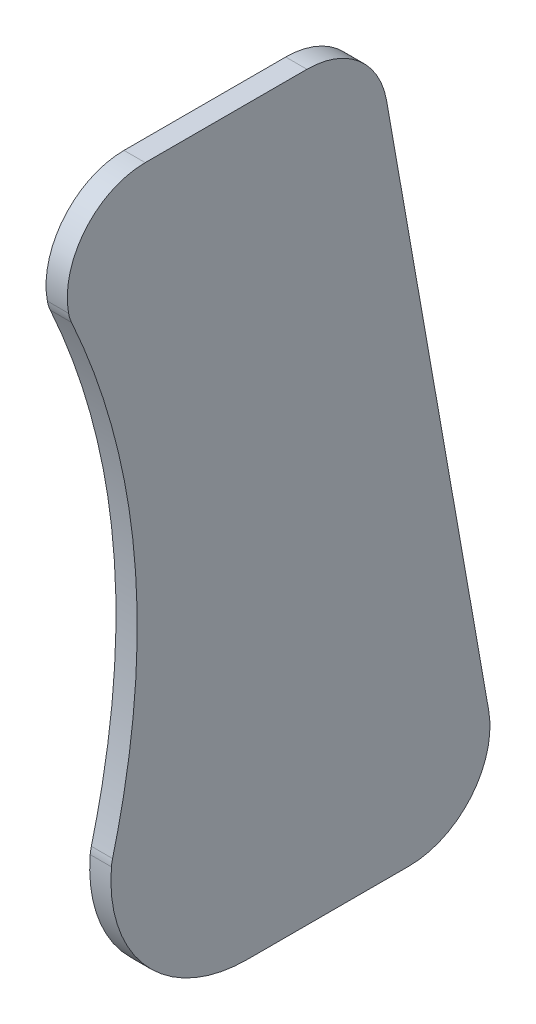
ISO-10303-21;
HEADER;
FILE_DESCRIPTION(('STEP AP214'),'2;1');
FILE_NAME('part.step','',(''),(''),'','','');
FILE_SCHEMA(('AUTOMOTIVE_DESIGN { 1 0 10303 214 1 1 1 1 }'));
ENDSEC;
DATA;
#1=APPLICATION_CONTEXT('core data for automotive mechanical design processes');
#2=APPLICATION_PROTOCOL_DEFINITION('international standard','automotive_design',2000,#1);
#3=PRODUCT_CONTEXT('',#1,'mechanical');
#4=PRODUCT('Part','Part','',(#3));
#5=PRODUCT_RELATED_PRODUCT_CATEGORY('part','',(#4));
#6=PRODUCT_DEFINITION_FORMATION('','',#4);
#7=PRODUCT_DEFINITION_CONTEXT('part definition',#1,'design');
#8=PRODUCT_DEFINITION('design','',#6,#7);
#9=PRODUCT_DEFINITION_SHAPE('','',#8);
#10=(LENGTH_UNIT() NAMED_UNIT(*) SI_UNIT(.MILLI.,.METRE.));
#11=(NAMED_UNIT(*) PLANE_ANGLE_UNIT() SI_UNIT($,.RADIAN.));
#12=(NAMED_UNIT(*) SI_UNIT($,.STERADIAN.) SOLID_ANGLE_UNIT());
#13=UNCERTAINTY_MEASURE_WITH_UNIT(LENGTH_MEASURE(1.E-05),#10,'distance_accuracy_value','');
#14=(GEOMETRIC_REPRESENTATION_CONTEXT(3) GLOBAL_UNCERTAINTY_ASSIGNED_CONTEXT((#13)) GLOBAL_UNIT_ASSIGNED_CONTEXT((#10,
#11,#12)) REPRESENTATION_CONTEXT('',''));
#15=CARTESIAN_POINT('',(0.,0.,0.));
#16=DIRECTION('',(0.,0.,1.));
#17=DIRECTION('',(1.,0.,0.));
#18=AXIS2_PLACEMENT_3D('',#15,#16,#17);
#19=CARTESIAN_POINT('',(4.,46.3445201524656,-29.6211841329457));
#20=DIRECTION('',(-1.,0.,0.));
#21=DIRECTION('',(0.,0.,1.));
#22=AXIS2_PLACEMENT_3D('',#19,#20,#21);
#23=CYLINDRICAL_SURFACE('',#22,15.24);
#24=CARTESIAN_POINT('',(0.,46.3445201524656,-29.6211841329457));
#25=DIRECTION('',(1.,0.,0.));
#26=DIRECTION('',(0.,0.,-1.));
#27=AXIS2_PLACEMENT_3D('',#24,#25,#26);
#28=CIRCLE('',#27,15.24);
#29=CARTESIAN_POINT('',(0.,31.1045201524656,-29.6211841329457));
#30=VERTEX_POINT('',#29);
#31=CARTESIAN_POINT('',(0.,48.9909183801097,-44.6296542888517));
#32=VERTEX_POINT('',#31);
#33=EDGE_CURVE('E135',#30,#32,#28,.T.);
#34=ORIENTED_EDGE('',*,*,#33,.T.);
#35=DIRECTION('',(-1.,0.,0.));
#36=VECTOR('',#35,1.);
#37=CARTESIAN_POINT('',(4.,48.9909183801097,-44.6296542888517));
#38=LINE('',#37,#36);
#39=CARTESIAN_POINT('',(4.,48.9909183801097,-44.6296542888517));
#40=VERTEX_POINT('',#39);
#41=EDGE_CURVE('E116',#40,#32,#38,.T.);
#42=ORIENTED_EDGE('',*,*,#41,.F.);
#43=CARTESIAN_POINT('',(4.,46.3445201524656,-29.6211841329457));
#44=DIRECTION('',(1.,0.,0.));
#45=DIRECTION('',(0.,0.,-1.));
#46=AXIS2_PLACEMENT_3D('',#43,#44,#45);
#47=CIRCLE('',#46,15.24);
#48=CARTESIAN_POINT('',(4.,31.1045201524656,-29.6211841329457));
#49=VERTEX_POINT('',#48);
#50=EDGE_CURVE('E123',#49,#40,#47,.T.);
#51=ORIENTED_EDGE('',*,*,#50,.F.);
#52=DIRECTION('',(-1.,0.,0.));
#53=VECTOR('',#52,1.);
#54=CARTESIAN_POINT('',(4.,31.1045201524656,-29.6211841329457));
#55=LINE('',#54,#53);
#56=EDGE_CURVE('E174',#49,#30,#55,.T.);
#57=ORIENTED_EDGE('',*,*,#56,.T.);
#58=EDGE_LOOP('',(#34,#42,#51,#57));
#59=FACE_BOUND('',#58,.T.);
#60=ADVANCED_FACE('F35',(#59),#23,.T.);
#61=CARTESIAN_POINT('',(4.,48.9909183801097,-44.6296542888517));
#62=DIRECTION('',(0.,-0.173648177666935,0.984807753012207));
#63=DIRECTION('',(0.,-0.984807753012207,-0.173648177666935));
#64=AXIS2_PLACEMENT_3D('',#61,#62,#63);
#65=PLANE('',#64);
#66=DIRECTION('',(0.,0.984807753012207,0.173648177666935));
#67=VECTOR('',#66,1.);
#68=CARTESIAN_POINT('',(0.,48.9909183801097,-44.6296542888517));
#69=LINE('',#68,#67);
#70=CARTESIAN_POINT('',(0.,158.21091838011,-25.3712214558727));
#71=VERTEX_POINT('',#70);
#72=EDGE_CURVE('E195',#32,#71,#69,.T.);
#73=ORIENTED_EDGE('',*,*,#72,.T.);
#74=DIRECTION('',(-1.,0.,0.));
#75=VECTOR('',#74,1.);
#76=CARTESIAN_POINT('',(4.,158.21091838011,-25.3712214558727));
#77=LINE('',#76,#75);
#78=CARTESIAN_POINT('',(4.,158.21091838011,-25.3712214558727));
#79=VERTEX_POINT('',#78);
#80=EDGE_CURVE('E119',#79,#71,#77,.T.);
#81=ORIENTED_EDGE('',*,*,#80,.F.);
#82=DIRECTION('',(0.,0.984807753012207,0.173648177666935));
#83=VECTOR('',#82,1.);
#84=CARTESIAN_POINT('',(4.,48.9909183801097,-44.6296542888517));
#85=LINE('',#84,#83);
#86=EDGE_CURVE('E112',#40,#79,#85,.T.);
#87=ORIENTED_EDGE('',*,*,#86,.F.);
#88=ORIENTED_EDGE('',*,*,#41,.T.);
#89=EDGE_LOOP('',(#73,#81,#87,#88));
#90=FACE_BOUND('',#89,.T.);
#91=ADVANCED_FACE('F114',(#90),#65,.F.);
#92=CARTESIAN_POINT('',(4.,155.564520152466,-10.3627512999666));
#93=DIRECTION('',(-1.,0.,0.));
#94=DIRECTION('',(0.,0.,1.));
#95=AXIS2_PLACEMENT_3D('',#92,#93,#94);
#96=CYLINDRICAL_SURFACE('',#95,15.24);
#97=CARTESIAN_POINT('',(0.,155.564520152466,-10.3627512999666));
#98=DIRECTION('',(1.,0.,0.));
#99=DIRECTION('',(0.,0.,-1.));
#100=AXIS2_PLACEMENT_3D('',#97,#98,#99);
#101=CIRCLE('',#100,15.24);
#102=CARTESIAN_POINT('',(0.,170.804520152466,-10.3627512999666));
#103=VERTEX_POINT('',#102);
#104=EDGE_CURVE('E192',#71,#103,#101,.T.);
#105=ORIENTED_EDGE('',*,*,#104,.T.);
#106=DIRECTION('',(-1.,0.,0.));
#107=VECTOR('',#106,1.);
#108=CARTESIAN_POINT('',(4.,170.804520152466,-10.3627512999666));
#109=LINE('',#108,#107);
#110=CARTESIAN_POINT('',(4.,170.804520152466,-10.3627512999666));
#111=VERTEX_POINT('',#110);
#112=EDGE_CURVE('E141',#111,#103,#109,.T.);
#113=ORIENTED_EDGE('',*,*,#112,.F.);
#114=CARTESIAN_POINT('',(4.,155.564520152466,-10.3627512999666));
#115=DIRECTION('',(1.,0.,0.));
#116=DIRECTION('',(0.,0.,-1.));
#117=AXIS2_PLACEMENT_3D('',#114,#115,#116);
#118=CIRCLE('',#117,15.24);
#119=EDGE_CURVE('E122',#79,#111,#118,.T.);
#120=ORIENTED_EDGE('',*,*,#119,.F.);
#121=ORIENTED_EDGE('',*,*,#80,.T.);
#122=EDGE_LOOP('',(#105,#113,#120,#121));
#123=FACE_BOUND('',#122,.T.);
#124=ADVANCED_FACE('F224',(#123),#96,.T.);
#125=CARTESIAN_POINT('',(4.,170.804520152466,-10.3627512999666));
#126=DIRECTION('',(0.,-1.,0.));
#127=DIRECTION('',(0.,0.,-1.));
#128=AXIS2_PLACEMENT_3D('',#125,#126,#127);
#129=PLANE('',#128);
#130=DIRECTION('',(0.,0.,1.));
#131=VECTOR('',#130,1.);
#132=CARTESIAN_POINT('',(0.,170.804520152466,-10.3627512999666));
#133=LINE('',#132,#131);
#134=CARTESIAN_POINT('',(0.,170.804520152466,20.1172487000334));
#135=VERTEX_POINT('',#134);
#136=EDGE_CURVE('E187',#103,#135,#133,.T.);
#137=ORIENTED_EDGE('',*,*,#136,.T.);
#138=DIRECTION('',(-1.,0.,0.));
#139=VECTOR('',#138,1.);
#140=CARTESIAN_POINT('',(4.,170.804520152466,20.1172487000334));
#141=LINE('',#140,#139);
#142=CARTESIAN_POINT('',(4.,170.804520152466,20.1172487000334));
#143=VERTEX_POINT('',#142);
#144=EDGE_CURVE('E178',#143,#135,#141,.T.);
#145=ORIENTED_EDGE('',*,*,#144,.F.);
#146=DIRECTION('',(0.,0.,1.));
#147=VECTOR('',#146,1.);
#148=CARTESIAN_POINT('',(4.,170.804520152466,-10.3627512999666));
#149=LINE('',#148,#147);
#150=EDGE_CURVE('E188',#111,#143,#149,.T.);
#151=ORIENTED_EDGE('',*,*,#150,.F.);
#152=ORIENTED_EDGE('',*,*,#112,.T.);
#153=EDGE_LOOP('',(#137,#145,#151,#152));
#154=FACE_BOUND('',#153,.T.);
#155=ADVANCED_FACE('F185',(#154),#129,.F.);
#156=CARTESIAN_POINT('',(4.,156.112575723704,20.1172487000334));
#157=DIRECTION('',(-1.,0.,0.));
#158=DIRECTION('',(0.,0.,1.));
#159=AXIS2_PLACEMENT_3D('',#156,#157,#158);
#160=CYLINDRICAL_SURFACE('',#159,14.6919444287617);
#161=CARTESIAN_POINT('',(0.,156.112575723704,20.1172487000334));
#162=DIRECTION('',(1.,0.,0.));
#163=DIRECTION('',(0.,0.,-1.));
#164=AXIS2_PLACEMENT_3D('',#161,#162,#163);
#165=CIRCLE('',#164,14.6919444287617);
#166=CARTESIAN_POINT('',(0.,153.426504062053,34.5615641952826));
#167=VERTEX_POINT('',#166);
#168=EDGE_CURVE('E168',#135,#167,#165,.T.);
#169=ORIENTED_EDGE('',*,*,#168,.T.);
#170=DIRECTION('',(-1.,0.,0.));
#171=VECTOR('',#170,1.);
#172=CARTESIAN_POINT('',(4.,153.426504062053,34.5615641952826));
#173=LINE('',#172,#171);
#174=CARTESIAN_POINT('',(4.,153.426504062053,34.5615641952826));
#175=VERTEX_POINT('',#174);
#176=EDGE_CURVE('E146',#167,#175,#173,.F.);
#177=ORIENTED_EDGE('',*,*,#176,.T.);
#178=CARTESIAN_POINT('',(4.,156.112575723704,20.1172487000334));
#179=DIRECTION('',(1.,0.,0.));
#180=DIRECTION('',(0.,0.,-1.));
#181=AXIS2_PLACEMENT_3D('',#178,#179,#180);
#182=CIRCLE('',#181,14.6919444287617);
#183=EDGE_CURVE('E207',#143,#175,#182,.T.);
#184=ORIENTED_EDGE('',*,*,#183,.F.);
#185=ORIENTED_EDGE('',*,*,#144,.T.);
#186=EDGE_LOOP('',(#169,#177,#184,#185));
#187=FACE_BOUND('',#186,.T.);
#188=ADVANCED_FACE('F217',(#187),#160,.T.);
#189=CARTESIAN_POINT('',(4.,152.349438610997,34.3190806300623));
#190=CARTESIAN_POINT('',(4.,107.792988448049,13.825923221204));
#191=CARTESIAN_POINT('',(4.,59.7300075429383,26.4163987983167));
#192=B_SPLINE_CURVE_WITH_KNOTS('',2,(#189,#190,#191),.UNSPECIFIED.,.F.,.F.,(3,3),(0.,1.),.UNSPECIFIED.);
#193=DIRECTION('',(-1.,0.,0.));
#194=VECTOR('',#193,1.);
#195=SURFACE_OF_LINEAR_EXTRUSION('',#192,#194);
#196=CARTESIAN_POINT('',(0.,152.349438610997,34.3190806300623));
#197=CARTESIAN_POINT('',(0.,107.792988448049,13.825923221204));
#198=CARTESIAN_POINT('',(0.,59.7300075429383,26.4163987983167));
#199=B_SPLINE_CURVE_WITH_KNOTS('',2,(#196,#197,#198),.UNSPECIFIED.,.F.,.F.,(3,3),(0.,1.),.UNSPECIFIED.);
#200=CARTESIAN_POINT('',(0.,151.669589312084,34.0084110411649));
#201=VERTEX_POINT('',#200);
#202=CARTESIAN_POINT('',(0.,60.2845038430201,26.2722148727476));
#203=VERTEX_POINT('',#202);
#204=EDGE_CURVE('E165',#201,#203,#199,.T.);
#205=ORIENTED_EDGE('',*,*,#204,.T.);
#206=DIRECTION('',(-1.,0.,0.));
#207=VECTOR('',#206,1.);
#208=CARTESIAN_POINT('',(0.,60.2845038430201,26.2722148727476));
#209=LINE('',#208,#207);
#210=CARTESIAN_POINT('',(4.,60.2845038430201,26.2722148727476));
#211=VERTEX_POINT('',#210);
#212=EDGE_CURVE('E43',#203,#211,#209,.F.);
#213=ORIENTED_EDGE('',*,*,#212,.T.);
#214=CARTESIAN_POINT('',(4.,151.669589312084,34.0084110411649));
#215=VERTEX_POINT('',#214);
#216=EDGE_CURVE('E202',#215,#211,#192,.T.);
#217=ORIENTED_EDGE('',*,*,#216,.F.);
#218=DIRECTION('',(-1.,0.,0.));
#219=VECTOR('',#218,1.);
#220=CARTESIAN_POINT('',(4.,151.669589312084,34.0084110411649));
#221=LINE('',#220,#219);
#222=EDGE_CURVE('E136',#215,#201,#221,.T.);
#223=ORIENTED_EDGE('',*,*,#222,.T.);
#224=EDGE_LOOP('',(#205,#213,#217,#223));
#225=FACE_BOUND('',#224,.T.);
#226=ADVANCED_FACE('F213',(#225),#195,.F.);
#227=CARTESIAN_POINT('',(4.,56.826502691016,0.858815867054302));
#228=DIRECTION('',(-1.,0.,0.));
#229=DIRECTION('',(0.,0.,1.));
#230=AXIS2_PLACEMENT_3D('',#227,#228,#229);
#231=CYLINDRICAL_SURFACE('',#230,25.7219825385504);
#232=CARTESIAN_POINT('',(4.,56.826502691016,0.858815867054302));
#233=DIRECTION('',(1.,0.,0.));
#234=DIRECTION('',(0.,0.,1.));
#235=AXIS2_PLACEMENT_3D('',#232,#233,#234);
#236=CIRCLE('',#235,25.7219825385504);
#237=CARTESIAN_POINT('',(4.,59.0342580195976,26.4858758256725));
#238=VERTEX_POINT('',#237);
#239=CARTESIAN_POINT('',(4.,31.1045201524656,0.858815867054304));
#240=VERTEX_POINT('',#239);
#241=EDGE_CURVE('E160',#238,#240,#236,.T.);
#242=ORIENTED_EDGE('',*,*,#241,.F.);
#243=DIRECTION('',(-1.,0.,0.));
#244=VECTOR('',#243,1.);
#245=CARTESIAN_POINT('',(4.,59.0342580195976,26.4858758256725));
#246=LINE('',#245,#244);
#247=CARTESIAN_POINT('',(0.,59.0342580195976,26.4858758256725));
#248=VERTEX_POINT('',#247);
#249=EDGE_CURVE('E150',#238,#248,#246,.T.);
#250=ORIENTED_EDGE('',*,*,#249,.T.);
#251=CARTESIAN_POINT('',(0.,56.826502691016,0.858815867054302));
#252=DIRECTION('',(1.,0.,0.));
#253=DIRECTION('',(0.,0.,1.));
#254=AXIS2_PLACEMENT_3D('',#251,#252,#253);
#255=CIRCLE('',#254,25.7219825385504);
#256=CARTESIAN_POINT('',(0.,31.1045201524656,0.858815867054304));
#257=VERTEX_POINT('',#256);
#258=EDGE_CURVE('E158',#248,#257,#255,.T.);
#259=ORIENTED_EDGE('',*,*,#258,.T.);
#260=DIRECTION('',(-1.,0.,0.));
#261=VECTOR('',#260,1.);
#262=CARTESIAN_POINT('',(4.,31.1045201524656,0.858815867054304));
#263=LINE('',#262,#261);
#264=EDGE_CURVE('E176',#240,#257,#263,.T.);
#265=ORIENTED_EDGE('',*,*,#264,.F.);
#266=EDGE_LOOP('',(#242,#250,#259,#265));
#267=FACE_BOUND('',#266,.T.);
#268=ADVANCED_FACE('F156',(#267),#231,.T.);
#269=CARTESIAN_POINT('',(4.,31.1045201524656,0.858815867054304));
#270=DIRECTION('',(0.,1.,0.));
#271=DIRECTION('',(0.,0.,1.));
#272=AXIS2_PLACEMENT_3D('',#269,#270,#271);
#273=PLANE('',#272);
#274=DIRECTION('',(0.,0.,-1.));
#275=VECTOR('',#274,1.);
#276=CARTESIAN_POINT('',(0.,31.1045201524656,0.858815867054304));
#277=LINE('',#276,#275);
#278=EDGE_CURVE('E132',#257,#30,#277,.T.);
#279=ORIENTED_EDGE('',*,*,#278,.T.);
#280=ORIENTED_EDGE('',*,*,#56,.F.);
#281=DIRECTION('',(0.,0.,-1.));
#282=VECTOR('',#281,1.);
#283=CARTESIAN_POINT('',(4.,31.1045201524656,0.858815867054304));
#284=LINE('',#283,#282);
#285=EDGE_CURVE('E128',#240,#49,#284,.T.);
#286=ORIENTED_EDGE('',*,*,#285,.F.);
#287=ORIENTED_EDGE('',*,*,#264,.T.);
#288=EDGE_LOOP('',(#279,#280,#286,#287));
#289=FACE_BOUND('',#288,.T.);
#290=ADVANCED_FACE('F245',(#289),#273,.F.);
#291=CARTESIAN_POINT('',(4.,46.3445201524656,-29.6211841329457));
#292=DIRECTION('',(1.,0.,0.));
#293=DIRECTION('',(0.,0.,-1.));
#294=AXIS2_PLACEMENT_3D('',#291,#292,#293);
#295=PLANE('',#294);
#296=ORIENTED_EDGE('',*,*,#216,.T.);
#297=CARTESIAN_POINT('',(4.,58.3802222904862,18.8939961331954));
#298=DIRECTION('',(1.,0.,0.));
#299=DIRECTION('',(0.,0.,-1.));
#300=AXIS2_PLACEMENT_3D('',#297,#298,#299);
#301=CIRCLE('',#300,7.62);
#302=EDGE_CURVE('E11',#211,#238,#301,.T.);
#303=ORIENTED_EDGE('',*,*,#302,.T.);
#304=ORIENTED_EDGE('',*,*,#241,.T.);
#305=ORIENTED_EDGE('',*,*,#285,.T.);
#306=ORIENTED_EDGE('',*,*,#50,.T.);
#307=ORIENTED_EDGE('',*,*,#86,.T.);
#308=ORIENTED_EDGE('',*,*,#119,.T.);
#309=ORIENTED_EDGE('',*,*,#150,.T.);
#310=ORIENTED_EDGE('',*,*,#183,.T.);
#311=CARTESIAN_POINT('',(4.,154.819639338396,27.0699973296792));
#312=DIRECTION('',(1.,0.,0.));
#313=DIRECTION('',(0.,0.,-1.));
#314=AXIS2_PLACEMENT_3D('',#311,#312,#313);
#315=CIRCLE('',#314,7.62);
#316=EDGE_CURVE('E148',#175,#215,#315,.T.);
#317=ORIENTED_EDGE('',*,*,#316,.T.);
#318=EDGE_LOOP('',(#296,#303,#304,#305,#306,#307,#308,#309,#310,#317));
#319=FACE_BOUND('',#318,.T.);
#320=ADVANCED_FACE('F126',(#319),#295,.T.);
#321=CARTESIAN_POINT('',(0.,46.3445201524656,-29.6211841329457));
#322=DIRECTION('',(1.,0.,0.));
#323=DIRECTION('',(0.,0.,-1.));
#324=AXIS2_PLACEMENT_3D('',#321,#322,#323);
#325=PLANE('',#324);
#326=ORIENTED_EDGE('',*,*,#258,.F.);
#327=CARTESIAN_POINT('',(0.,58.3802222904862,18.8939961331954));
#328=DIRECTION('',(1.,0.,0.));
#329=DIRECTION('',(0.,0.,-1.));
#330=AXIS2_PLACEMENT_3D('',#327,#328,#329);
#331=CIRCLE('',#330,7.62);
#332=EDGE_CURVE('E57',#248,#203,#331,.F.);
#333=ORIENTED_EDGE('',*,*,#332,.T.);
#334=ORIENTED_EDGE('',*,*,#204,.F.);
#335=CARTESIAN_POINT('',(0.,154.819639338396,27.0699973296792));
#336=DIRECTION('',(1.,0.,0.));
#337=DIRECTION('',(0.,0.,-1.));
#338=AXIS2_PLACEMENT_3D('',#335,#336,#337);
#339=CIRCLE('',#338,7.62);
#340=EDGE_CURVE('E139',#201,#167,#339,.F.);
#341=ORIENTED_EDGE('',*,*,#340,.T.);
#342=ORIENTED_EDGE('',*,*,#168,.F.);
#343=ORIENTED_EDGE('',*,*,#136,.F.);
#344=ORIENTED_EDGE('',*,*,#104,.F.);
#345=ORIENTED_EDGE('',*,*,#72,.F.);
#346=ORIENTED_EDGE('',*,*,#33,.F.);
#347=ORIENTED_EDGE('',*,*,#278,.F.);
#348=EDGE_LOOP('',(#326,#333,#334,#341,#342,#343,#344,#345,#346,#347));
#349=FACE_BOUND('',#348,.T.);
#350=ADVANCED_FACE('F164',(#349),#325,.F.);
#351=CARTESIAN_POINT('',(2.,154.819639338396,27.0699973296792));
#352=DIRECTION('',(-1.,0.,0.));
#353=DIRECTION('',(0.,0.,1.));
#354=AXIS2_PLACEMENT_3D('',#351,#352,#353);
#355=CYLINDRICAL_SURFACE('',#354,7.62);
#356=ORIENTED_EDGE('',*,*,#316,.F.);
#357=ORIENTED_EDGE('',*,*,#176,.F.);
#358=ORIENTED_EDGE('',*,*,#340,.F.);
#359=ORIENTED_EDGE('',*,*,#222,.F.);
#360=EDGE_LOOP('',(#356,#357,#358,#359));
#361=FACE_BOUND('',#360,.T.);
#362=ADVANCED_FACE('F230',(#361),#355,.T.);
#363=CARTESIAN_POINT('',(2.,58.3802222904862,18.8939961331954));
#364=DIRECTION('',(-1.,0.,0.));
#365=DIRECTION('',(0.,0.,1.));
#366=AXIS2_PLACEMENT_3D('',#363,#364,#365);
#367=CYLINDRICAL_SURFACE('',#366,7.62);
#368=ORIENTED_EDGE('',*,*,#302,.F.);
#369=ORIENTED_EDGE('',*,*,#212,.F.);
#370=ORIENTED_EDGE('',*,*,#332,.F.);
#371=ORIENTED_EDGE('',*,*,#249,.F.);
#372=EDGE_LOOP('',(#368,#369,#370,#371));
#373=FACE_BOUND('',#372,.T.);
#374=ADVANCED_FACE('F37',(#373),#367,.T.);
#375=CLOSED_SHELL('',(#60,#91,#124,#155,#188,#226,#268,#290,#320,#350,#362,#374));
#376=MANIFOLD_SOLID_BREP('B2',#375);
#377=ADVANCED_BREP_SHAPE_REPRESENTATION('',(#18,#376),#14);
#378=SHAPE_DEFINITION_REPRESENTATION(#9,#377);
ENDSEC;
END-ISO-10303-21;
